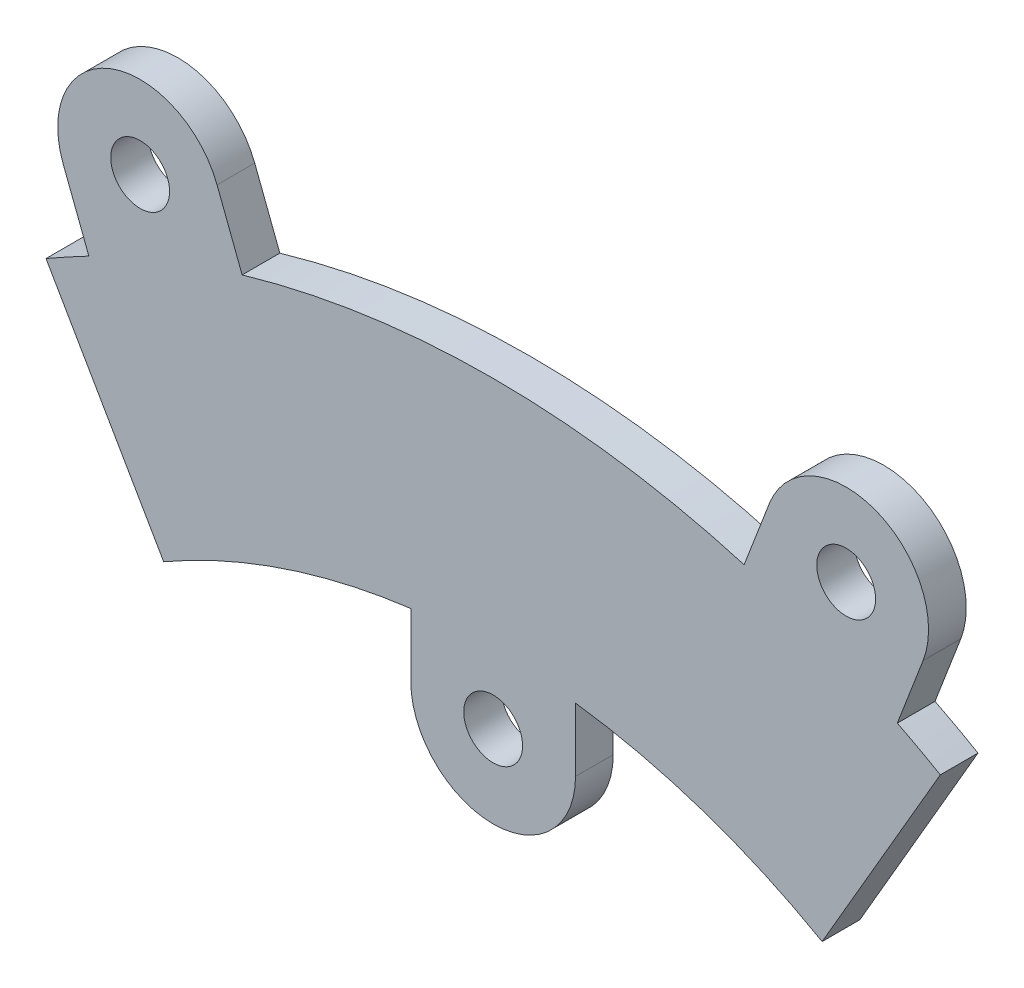
ISO-10303-21;
HEADER;
FILE_DESCRIPTION(('STEP AP214'),'2;1');
FILE_NAME('part.step','',(''),(''),'','','');
FILE_SCHEMA(('AUTOMOTIVE_DESIGN { 1 0 10303 214 1 1 1 1 }'));
ENDSEC;
DATA;
#1=APPLICATION_CONTEXT('core data for automotive mechanical design processes');
#2=APPLICATION_PROTOCOL_DEFINITION('international standard','automotive_design',2000,#1);
#3=PRODUCT_CONTEXT('',#1,'mechanical');
#4=PRODUCT('Part','Part','',(#3));
#5=PRODUCT_RELATED_PRODUCT_CATEGORY('part','',(#4));
#6=PRODUCT_DEFINITION_FORMATION('','',#4);
#7=PRODUCT_DEFINITION_CONTEXT('part definition',#1,'design');
#8=PRODUCT_DEFINITION('design','',#6,#7);
#9=PRODUCT_DEFINITION_SHAPE('','',#8);
#10=(LENGTH_UNIT() NAMED_UNIT(*) SI_UNIT(.MILLI.,.METRE.));
#11=(NAMED_UNIT(*) PLANE_ANGLE_UNIT() SI_UNIT($,.RADIAN.));
#12=(NAMED_UNIT(*) SI_UNIT($,.STERADIAN.) SOLID_ANGLE_UNIT());
#13=UNCERTAINTY_MEASURE_WITH_UNIT(LENGTH_MEASURE(1.E-05),#10,'distance_accuracy_value','');
#14=(GEOMETRIC_REPRESENTATION_CONTEXT(3) GLOBAL_UNCERTAINTY_ASSIGNED_CONTEXT((#13)) GLOBAL_UNIT_ASSIGNED_CONTEXT((#10,
#11,#12)) REPRESENTATION_CONTEXT('',''));
#15=CARTESIAN_POINT('',(0.,0.,0.));
#16=DIRECTION('',(0.,0.,1.));
#17=DIRECTION('',(1.,0.,0.));
#18=AXIS2_PLACEMENT_3D('',#15,#16,#17);
#19=CARTESIAN_POINT('',(-14.,24.249000549316,0.));
#20=DIRECTION('',(0.,0.,1.));
#21=DIRECTION('',(1.,0.,0.));
#22=AXIS2_PLACEMENT_3D('',#19,#20,#21);
#23=PLANE('',#22);
#24=CARTESIAN_POINT('',(15.00000048,38.0000002,0.));
#25=DIRECTION('',(0.,0.,1.));
#26=DIRECTION('',(1.,0.,0.));
#27=AXIS2_PLACEMENT_3D('',#24,#25,#26);
#28=CIRCLE('',#27,1.25000004);
#29=CARTESIAN_POINT('',(16.25000052,38.0000002,0.));
#30=VERTEX_POINT('',#29);
#31=EDGE_CURVE('E28',#30,#30,#28,.T.);
#32=ORIENTED_EDGE('',*,*,#31,.F.);
#33=EDGE_LOOP('',(#32));
#34=FACE_BOUND('',#33,.T.);
#35=CARTESIAN_POINT('',(0.,25.1000006,0.));
#36=DIRECTION('',(0.,0.,1.));
#37=DIRECTION('',(1.,0.,0.));
#38=AXIS2_PLACEMENT_3D('',#35,#36,#37);
#39=CIRCLE('',#38,1.25000004);
#40=CARTESIAN_POINT('',(1.25000004,25.1000006,0.));
#41=VERTEX_POINT('',#40);
#42=EDGE_CURVE('E320',#41,#41,#39,.T.);
#43=ORIENTED_EDGE('',*,*,#42,.F.);
#44=EDGE_LOOP('',(#43));
#45=FACE_BOUND('',#44,.T.);
#46=CARTESIAN_POINT('',(-15.00000048,38.0000002,0.));
#47=DIRECTION('',(0.,0.,1.));
#48=DIRECTION('',(1.,0.,0.));
#49=AXIS2_PLACEMENT_3D('',#46,#47,#48);
#50=CIRCLE('',#49,1.25000004);
#51=CARTESIAN_POINT('',(-13.75000044,38.0000002,0.));
#52=VERTEX_POINT('',#51);
#53=EDGE_CURVE('E156',#52,#52,#50,.T.);
#54=ORIENTED_EDGE('',*,*,#53,.F.);
#55=EDGE_LOOP('',(#54));
#56=FACE_BOUND('',#55,.T.);
#57=CARTESIAN_POINT('',(-0.0002940403183249,-0.004165200069904,0.));
#58=DIRECTION('',(0.,0.,1.));
#59=DIRECTION('',(-0.124972936293963,0.99216015098071,0.));
#60=AXIS2_PLACEMENT_3D('',#57,#58,#59);
#61=CIRCLE('',#60,28.003710750984);
#62=CARTESIAN_POINT('',(-3.5,27.780000686646,0.));
#63=VERTEX_POINT('',#62);
#64=CARTESIAN_POINT('',(-14.,24.249000549316,0.));
#65=VERTEX_POINT('',#64);
#66=EDGE_CURVE('E265',#63,#65,#61,.T.);
#67=ORIENTED_EDGE('',*,*,#66,.F.);
#68=DIRECTION('',(0.,1.,0.));
#69=VECTOR('',#68,1.);
#70=CARTESIAN_POINT('',(-3.5,25.10000038147,0.));
#71=LINE('',#70,#69);
#72=CARTESIAN_POINT('',(-3.5,25.10000038147,0.));
#73=VERTEX_POINT('',#72);
#74=EDGE_CURVE('E258',#73,#63,#71,.T.);
#75=ORIENTED_EDGE('',*,*,#74,.F.);
#76=CARTESIAN_POINT('',(0.,25.10000038147,0.));
#77=DIRECTION('',(0.,0.,-1.));
#78=DIRECTION('',(1.,0.,0.));
#79=AXIS2_PLACEMENT_3D('',#76,#77,#78);
#80=CIRCLE('',#79,3.5);
#81=CARTESIAN_POINT('',(3.5,25.10000038147,0.));
#82=VERTEX_POINT('',#81);
#83=EDGE_CURVE('E362',#82,#73,#80,.T.);
#84=ORIENTED_EDGE('',*,*,#83,.F.);
#85=DIRECTION('',(0.,-1.,0.));
#86=VECTOR('',#85,1.);
#87=CARTESIAN_POINT('',(3.5,27.799999237061,0.));
#88=LINE('',#87,#86);
#89=CARTESIAN_POINT('',(3.5,27.799999237061,0.));
#90=VERTEX_POINT('',#89);
#91=EDGE_CURVE('E287',#90,#82,#88,.T.);
#92=ORIENTED_EDGE('',*,*,#91,.F.);
#93=CARTESIAN_POINT('',(-0.218642823997,-0.497597265043,0.));
#94=DIRECTION('',(0.,0.,1.));
#95=DIRECTION('',(0.497414188617854,0.867513184315744,0.));
#96=AXIS2_PLACEMENT_3D('',#93,#94,#95);
#97=CIRCLE('',#96,28.540887727054);
#98=CARTESIAN_POINT('',(13.977999687195,24.261999130249,0.));
#99=VERTEX_POINT('',#98);
#100=EDGE_CURVE('E358',#99,#90,#97,.T.);
#101=ORIENTED_EDGE('',*,*,#100,.F.);
#102=DIRECTION('',(-0.502222335358218,-0.864738530347375,0.));
#103=VECTOR('',#102,1.);
#104=CARTESIAN_POINT('',(19.,32.909000396729,0.));
#105=LINE('',#104,#103);
#106=CARTESIAN_POINT('',(19.,32.909000396729,0.));
#107=VERTEX_POINT('',#106);
#108=EDGE_CURVE('E301',#107,#99,#105,.T.);
#109=ORIENTED_EDGE('',*,*,#108,.F.);
#110=CARTESIAN_POINT('',(-0.140882213122,-0.268365842203,0.));
#111=DIRECTION('',(0.,0.,-1.));
#112=DIRECTION('',(0.452025546648997,0.892004991676995,0.));
#113=AXIS2_PLACEMENT_3D('',#110,#111,#112);
#114=CIRCLE('',#113,38.302885040801);
#115=CARTESIAN_POINT('',(17.173000335693,33.897998809814,0.));
#116=VERTEX_POINT('',#115);
#117=EDGE_CURVE('E281',#116,#107,#114,.T.);
#118=ORIENTED_EDGE('',*,*,#117,.F.);
#119=DIRECTION('',(-0.358869119723112,-0.93338789091629,0.));
#120=VECTOR('',#119,1.);
#121=CARTESIAN_POINT('',(18.267999649048,36.745998382568,0.));
#122=LINE('',#121,#120);
#123=CARTESIAN_POINT('',(18.267999649048,36.745998382568,0.));
#124=VERTEX_POINT('',#123);
#125=EDGE_CURVE('E21',#124,#116,#122,.T.);
#126=ORIENTED_EDGE('',*,*,#125,.F.);
#127=CARTESIAN_POINT('',(15.000000393159,38.000001024595,0.));
#128=DIRECTION('',(0.,0.,-1.));
#129=DIRECTION('',(-0.933625064146048,0.358251642841018,0.));
#130=AXIS2_PLACEMENT_3D('',#127,#128,#129);
#131=CIRCLE('',#130,3.500334521542);
#132=CARTESIAN_POINT('',(11.732000350952,39.254001617432,0.));
#133=VERTEX_POINT('',#132);
#134=EDGE_CURVE('E214',#133,#124,#131,.T.);
#135=ORIENTED_EDGE('',*,*,#134,.F.);
#136=DIRECTION('',(0.358340811677967,0.933590843295914,0.));
#137=VECTOR('',#136,1.);
#138=CARTESIAN_POINT('',(10.678000450134,36.507999420166,0.));
#139=LINE('',#138,#137);
#140=CARTESIAN_POINT('',(10.678000450134,36.507999420166,0.));
#141=VERTEX_POINT('',#140);
#142=EDGE_CURVE('E217',#141,#133,#139,.T.);
#143=ORIENTED_EDGE('',*,*,#142,.F.);
#144=DIRECTION('',(0.26765439554602,0.963514984079072,0.));
#145=VECTOR('',#144,1.);
#146=CARTESIAN_POINT('',(10.668000221252,36.47200012207,0.));
#147=LINE('',#146,#145);
#148=CARTESIAN_POINT('',(10.668000221252,36.47200012207,0.));
#149=VERTEX_POINT('',#148);
#150=EDGE_CURVE('E386',#149,#141,#147,.T.);
#151=ORIENTED_EDGE('',*,*,#150,.F.);
#152=CARTESIAN_POINT('',(-0.0002088742041915,-0.005718831380889,0.));
#153=DIRECTION('',(0.,0.,-1.));
#154=DIRECTION('',(-0.280610166316937,0.959821824381786,0.));
#155=AXIS2_PLACEMENT_3D('',#152,#153,#154);
#156=CIRCLE('',#155,38.005718850607);
#157=CARTESIAN_POINT('',(-10.66499996185,36.472999572754,0.));
#158=VERTEX_POINT('',#157);
#159=EDGE_CURVE('E80',#158,#149,#156,.T.);
#160=ORIENTED_EDGE('',*,*,#159,.F.);
#161=DIRECTION('',(0.358213953449175,-0.933639525488457,0.));
#162=VECTOR('',#161,1.);
#163=CARTESIAN_POINT('',(-11.73200035095,39.254001617432,0.));
#164=LINE('',#163,#162);
#165=CARTESIAN_POINT('',(-11.73200035095,39.254001617432,0.));
#166=VERTEX_POINT('',#165);
#167=EDGE_CURVE('E375',#166,#158,#164,.T.);
#168=ORIENTED_EDGE('',*,*,#167,.F.);
#169=CARTESIAN_POINT('',(-15.00000039315,38.000001024595,0.));
#170=DIRECTION('',(0.,0.,-1.));
#171=DIRECTION('',(-0.933624839505129,-0.35825222826805,0.));
#172=AXIS2_PLACEMENT_3D('',#169,#170,#171);
#173=CIRCLE('',#172,3.500334521542);
#174=CARTESIAN_POINT('',(-18.26799964904,36.745998382568,0.));
#175=VERTEX_POINT('',#174);
#176=EDGE_CURVE('E411',#175,#166,#173,.T.);
#177=ORIENTED_EDGE('',*,*,#176,.F.);
#178=DIRECTION('',(-0.358538525678012,0.933514930574031,0.));
#179=VECTOR('',#178,1.);
#180=CARTESIAN_POINT('',(-17.17799949646,33.908000946045,0.));
#181=LINE('',#180,#179);
#182=CARTESIAN_POINT('',(-17.17799949646,33.908000946045,0.));
#183=VERTEX_POINT('',#182);
#184=EDGE_CURVE('E274',#183,#175,#181,.T.);
#185=ORIENTED_EDGE('',*,*,#184,.F.);
#186=CARTESIAN_POINT('',(12.43769959597,-22.2668056281,0.));
#187=DIRECTION('',(0.,0.,-1.));
#188=DIRECTION('',(-0.4950543505401,0.868862008613175,0.));
#189=AXIS2_PLACEMENT_3D('',#186,#187,#188);
#190=CIRCLE('',#189,63.503531605541);
#191=CARTESIAN_POINT('',(-19.,32.909000396729,0.));
#192=VERTEX_POINT('',#191);
#193=EDGE_CURVE('E345',#192,#183,#190,.T.);
#194=ORIENTED_EDGE('',*,*,#193,.F.);
#195=DIRECTION('',(-0.500011006970785,0.866019048813628,0.));
#196=VECTOR('',#195,1.);
#197=CARTESIAN_POINT('',(-14.,24.249000549316,0.));
#198=LINE('',#197,#196);
#199=EDGE_CURVE('E325',#65,#192,#198,.T.);
#200=ORIENTED_EDGE('',*,*,#199,.F.);
#201=EDGE_LOOP('',(#67,#75,#84,#92,#101,#109,#118,#126,#135,#143,#151,#160,#168,#177,#185,#194,#200));
#202=FACE_BOUND('',#201,.T.);
#203=ADVANCED_FACE('F17',(#34,#45,#56,#202),#23,.T.);
#204=CARTESIAN_POINT('',(-14.,24.249000549316,-1.60143952));
#205=DIRECTION('',(0.,0.,1.));
#206=DIRECTION('',(1.,0.,0.));
#207=AXIS2_PLACEMENT_3D('',#204,#205,#206);
#208=PLANE('',#207);
#209=CARTESIAN_POINT('',(15.00000048,38.0000002,-1.60143952));
#210=DIRECTION('',(0.,0.,1.));
#211=DIRECTION('',(1.,0.,0.));
#212=AXIS2_PLACEMENT_3D('',#209,#210,#211);
#213=CIRCLE('',#212,1.25000004);
#214=CARTESIAN_POINT('',(16.25000052,38.0000002,-1.60143952));
#215=VERTEX_POINT('',#214);
#216=EDGE_CURVE('E11',#215,#215,#213,.T.);
#217=ORIENTED_EDGE('',*,*,#216,.T.);
#218=EDGE_LOOP('',(#217));
#219=FACE_BOUND('',#218,.T.);
#220=CARTESIAN_POINT('',(0.,25.1000006,-1.60143952));
#221=DIRECTION('',(0.,0.,1.));
#222=DIRECTION('',(1.,0.,0.));
#223=AXIS2_PLACEMENT_3D('',#220,#221,#222);
#224=CIRCLE('',#223,1.25000004);
#225=CARTESIAN_POINT('',(1.25000004,25.1000006,-1.60143952));
#226=VERTEX_POINT('',#225);
#227=EDGE_CURVE('E316',#226,#226,#224,.T.);
#228=ORIENTED_EDGE('',*,*,#227,.T.);
#229=EDGE_LOOP('',(#228));
#230=FACE_BOUND('',#229,.T.);
#231=CARTESIAN_POINT('',(-15.00000048,38.0000002,-1.60143952));
#232=DIRECTION('',(0.,0.,1.));
#233=DIRECTION('',(1.,0.,0.));
#234=AXIS2_PLACEMENT_3D('',#231,#232,#233);
#235=CIRCLE('',#234,1.25000004);
#236=CARTESIAN_POINT('',(-13.75000044,38.0000002,-1.60143952));
#237=VERTEX_POINT('',#236);
#238=EDGE_CURVE('E168',#237,#237,#235,.T.);
#239=ORIENTED_EDGE('',*,*,#238,.T.);
#240=EDGE_LOOP('',(#239));
#241=FACE_BOUND('',#240,.T.);
#242=DIRECTION('',(-0.500011006970785,0.866019048813628,0.));
#243=VECTOR('',#242,1.);
#244=CARTESIAN_POINT('',(-14.,24.249000549316,-1.60143952));
#245=LINE('',#244,#243);
#246=CARTESIAN_POINT('',(-14.,24.249000549316,-1.60143952));
#247=VERTEX_POINT('',#246);
#248=CARTESIAN_POINT('',(-19.,32.909000396729,-1.60143952));
#249=VERTEX_POINT('',#248);
#250=EDGE_CURVE('E334',#247,#249,#245,.T.);
#251=ORIENTED_EDGE('',*,*,#250,.T.);
#252=CARTESIAN_POINT('',(12.43769959597,-22.2668056281,-1.60143952));
#253=DIRECTION('',(0.,0.,-1.));
#254=DIRECTION('',(-0.4950543505401,0.868862008613175,0.));
#255=AXIS2_PLACEMENT_3D('',#252,#253,#254);
#256=CIRCLE('',#255,63.503531605541);
#257=CARTESIAN_POINT('',(-17.17799949646,33.908000946045,-1.60143952));
#258=VERTEX_POINT('',#257);
#259=EDGE_CURVE('E270',#249,#258,#256,.T.);
#260=ORIENTED_EDGE('',*,*,#259,.T.);
#261=DIRECTION('',(-0.358538525678012,0.933514930574031,0.));
#262=VECTOR('',#261,1.);
#263=CARTESIAN_POINT('',(-17.17799949646,33.908000946045,-1.60143952));
#264=LINE('',#263,#262);
#265=CARTESIAN_POINT('',(-18.26799964904,36.745998382568,-1.60143952));
#266=VERTEX_POINT('',#265);
#267=EDGE_CURVE('E403',#258,#266,#264,.T.);
#268=ORIENTED_EDGE('',*,*,#267,.T.);
#269=CARTESIAN_POINT('',(-15.00000039315,38.000001024595,-1.60143952));
#270=DIRECTION('',(0.,0.,-1.));
#271=DIRECTION('',(-0.933624839505129,-0.35825222826805,0.));
#272=AXIS2_PLACEMENT_3D('',#269,#270,#271);
#273=CIRCLE('',#272,3.500334521542);
#274=CARTESIAN_POINT('',(-11.73200035095,39.254001617432,-1.60143952));
#275=VERTEX_POINT('',#274);
#276=EDGE_CURVE('E372',#266,#275,#273,.T.);
#277=ORIENTED_EDGE('',*,*,#276,.T.);
#278=DIRECTION('',(0.358213953449175,-0.933639525488457,0.));
#279=VECTOR('',#278,1.);
#280=CARTESIAN_POINT('',(-11.73200035095,39.254001617432,-1.60143952));
#281=LINE('',#280,#279);
#282=CARTESIAN_POINT('',(-10.66499996185,36.472999572754,-1.60143952));
#283=VERTEX_POINT('',#282);
#284=EDGE_CURVE('E68',#275,#283,#281,.T.);
#285=ORIENTED_EDGE('',*,*,#284,.T.);
#286=CARTESIAN_POINT('',(-0.0002088742041915,-0.005718831380889,-1.60143952));
#287=DIRECTION('',(0.,0.,-1.));
#288=DIRECTION('',(-0.280610166316937,0.959821824381786,0.));
#289=AXIS2_PLACEMENT_3D('',#286,#287,#288);
#290=CIRCLE('',#289,38.005718850607);
#291=CARTESIAN_POINT('',(10.668000221252,36.47200012207,-1.60143952));
#292=VERTEX_POINT('',#291);
#293=EDGE_CURVE('E297',#283,#292,#290,.T.);
#294=ORIENTED_EDGE('',*,*,#293,.T.);
#295=DIRECTION('',(0.26765439554602,0.963514984079072,0.));
#296=VECTOR('',#295,1.);
#297=CARTESIAN_POINT('',(10.668000221252,36.47200012207,-1.60143952));
#298=LINE('',#297,#296);
#299=CARTESIAN_POINT('',(10.678000450134,36.507999420166,-1.60143952));
#300=VERTEX_POINT('',#299);
#301=EDGE_CURVE('E241',#292,#300,#298,.T.);
#302=ORIENTED_EDGE('',*,*,#301,.T.);
#303=DIRECTION('',(0.358340811677967,0.933590843295914,0.));
#304=VECTOR('',#303,1.);
#305=CARTESIAN_POINT('',(10.678000450134,36.507999420166,-1.60143952));
#306=LINE('',#305,#304);
#307=CARTESIAN_POINT('',(11.732000350952,39.254001617432,-1.60143952));
#308=VERTEX_POINT('',#307);
#309=EDGE_CURVE('E225',#300,#308,#306,.T.);
#310=ORIENTED_EDGE('',*,*,#309,.T.);
#311=CARTESIAN_POINT('',(15.000000393159,38.000001024595,-1.60143952));
#312=DIRECTION('',(0.,0.,-1.));
#313=DIRECTION('',(-0.933625064146048,0.358251642841018,0.));
#314=AXIS2_PLACEMENT_3D('',#311,#312,#313);
#315=CIRCLE('',#314,3.500334521542);
#316=CARTESIAN_POINT('',(18.267999649048,36.745998382568,-1.60143952));
#317=VERTEX_POINT('',#316);
#318=EDGE_CURVE('E231',#308,#317,#315,.T.);
#319=ORIENTED_EDGE('',*,*,#318,.T.);
#320=DIRECTION('',(-0.358869119723112,-0.93338789091629,0.));
#321=VECTOR('',#320,1.);
#322=CARTESIAN_POINT('',(18.267999649048,36.745998382568,-1.60143952));
#323=LINE('',#322,#321);
#324=CARTESIAN_POINT('',(17.173000335693,33.897998809814,-1.60143952));
#325=VERTEX_POINT('',#324);
#326=EDGE_CURVE('E288',#317,#325,#323,.T.);
#327=ORIENTED_EDGE('',*,*,#326,.T.);
#328=CARTESIAN_POINT('',(-0.140882213122,-0.268365842203,-1.60143952));
#329=DIRECTION('',(0.,0.,-1.));
#330=DIRECTION('',(0.452025546648997,0.892004991676995,0.));
#331=AXIS2_PLACEMENT_3D('',#328,#329,#330);
#332=CIRCLE('',#331,38.302885040801);
#333=CARTESIAN_POINT('',(19.,32.909000396729,-1.60143952));
#334=VERTEX_POINT('',#333);
#335=EDGE_CURVE('E280',#325,#334,#332,.T.);
#336=ORIENTED_EDGE('',*,*,#335,.T.);
#337=DIRECTION('',(-0.502222335358218,-0.864738530347375,0.));
#338=VECTOR('',#337,1.);
#339=CARTESIAN_POINT('',(19.,32.909000396729,-1.60143952));
#340=LINE('',#339,#338);
#341=CARTESIAN_POINT('',(13.977999687195,24.261999130249,-1.60143952));
#342=VERTEX_POINT('',#341);
#343=EDGE_CURVE('E306',#334,#342,#340,.T.);
#344=ORIENTED_EDGE('',*,*,#343,.T.);
#345=CARTESIAN_POINT('',(-0.218642823997,-0.497597265043,-1.60143952));
#346=DIRECTION('',(0.,0.,1.));
#347=DIRECTION('',(0.497414188617854,0.867513184315744,0.));
#348=AXIS2_PLACEMENT_3D('',#345,#346,#347);
#349=CIRCLE('',#348,28.540887727054);
#350=CARTESIAN_POINT('',(3.5,27.799999237061,-1.60143952));
#351=VERTEX_POINT('',#350);
#352=EDGE_CURVE('E315',#342,#351,#349,.T.);
#353=ORIENTED_EDGE('',*,*,#352,.T.);
#354=DIRECTION('',(0.,-1.,0.));
#355=VECTOR('',#354,1.);
#356=CARTESIAN_POINT('',(3.5,27.799999237061,-1.60143952));
#357=LINE('',#356,#355);
#358=CARTESIAN_POINT('',(3.5,25.10000038147,-1.60143952));
#359=VERTEX_POINT('',#358);
#360=EDGE_CURVE('E286',#351,#359,#357,.T.);
#361=ORIENTED_EDGE('',*,*,#360,.T.);
#362=CARTESIAN_POINT('',(0.,25.10000038147,-1.60143952));
#363=DIRECTION('',(0.,0.,-1.));
#364=DIRECTION('',(1.,0.,0.));
#365=AXIS2_PLACEMENT_3D('',#362,#363,#364);
#366=CIRCLE('',#365,3.5);
#367=CARTESIAN_POINT('',(-3.5,25.10000038147,-1.60143952));
#368=VERTEX_POINT('',#367);
#369=EDGE_CURVE('E371',#359,#368,#366,.T.);
#370=ORIENTED_EDGE('',*,*,#369,.T.);
#371=DIRECTION('',(0.,1.,0.));
#372=VECTOR('',#371,1.);
#373=CARTESIAN_POINT('',(-3.5,25.10000038147,-1.60143952));
#374=LINE('',#373,#372);
#375=CARTESIAN_POINT('',(-3.5,27.780000686646,-1.60143952));
#376=VERTEX_POINT('',#375);
#377=EDGE_CURVE('E257',#368,#376,#374,.T.);
#378=ORIENTED_EDGE('',*,*,#377,.T.);
#379=CARTESIAN_POINT('',(-0.0002940403183249,-0.004165200069904,-1.60143952));
#380=DIRECTION('',(0.,0.,1.));
#381=DIRECTION('',(-0.124972936293963,0.99216015098071,0.));
#382=AXIS2_PLACEMENT_3D('',#379,#380,#381);
#383=CIRCLE('',#382,28.003710750984);
#384=EDGE_CURVE('E269',#376,#247,#383,.T.);
#385=ORIENTED_EDGE('',*,*,#384,.T.);
#386=EDGE_LOOP('',(#251,#260,#268,#277,#285,#294,#302,#310,#319,#327,#336,#344,#353,#361,#370,
#378,#385));
#387=FACE_BOUND('',#386,.T.);
#388=ADVANCED_FACE('F333',(#219,#230,#241,#387),#208,.F.);
#389=CARTESIAN_POINT('',(15.00000048,38.0000002,-1.60143952));
#390=DIRECTION('',(0.,0.,-1.));
#391=DIRECTION('',(1.,0.,0.));
#392=AXIS2_PLACEMENT_3D('',#389,#390,#391);
#393=CYLINDRICAL_SURFACE('',#392,1.25000004);
#394=DIRECTION('',(0.,0.,1.));
#395=VECTOR('',#394,1.);
#396=CARTESIAN_POINT('',(16.25000052,38.0000002,-1.60143952));
#397=LINE('',#396,#395);
#398=EDGE_CURVE('E319',#215,#30,#397,.T.);
#399=ORIENTED_EDGE('',*,*,#398,.T.);
#400=ORIENTED_EDGE('',*,*,#31,.T.);
#401=ORIENTED_EDGE('',*,*,#398,.F.);
#402=ORIENTED_EDGE('',*,*,#216,.F.);
#403=EDGE_LOOP('',(#399,#400,#401,#402));
#404=FACE_BOUND('',#403,.T.);
#405=ADVANCED_FACE('F461',(#404),#393,.F.);
#406=CARTESIAN_POINT('',(0.,25.1000006,-1.60143952));
#407=DIRECTION('',(0.,0.,-1.));
#408=DIRECTION('',(1.,0.,0.));
#409=AXIS2_PLACEMENT_3D('',#406,#407,#408);
#410=CYLINDRICAL_SURFACE('',#409,1.25000004);
#411=DIRECTION('',(0.,0.,1.));
#412=VECTOR('',#411,1.);
#413=CARTESIAN_POINT('',(1.25000004,25.1000006,-1.60143952));
#414=LINE('',#413,#412);
#415=EDGE_CURVE('E261',#226,#41,#414,.T.);
#416=ORIENTED_EDGE('',*,*,#415,.T.);
#417=ORIENTED_EDGE('',*,*,#42,.T.);
#418=ORIENTED_EDGE('',*,*,#415,.F.);
#419=ORIENTED_EDGE('',*,*,#227,.F.);
#420=EDGE_LOOP('',(#416,#417,#418,#419));
#421=FACE_BOUND('',#420,.T.);
#422=ADVANCED_FACE('F632',(#421),#410,.F.);
#423=CARTESIAN_POINT('',(-15.00000048,38.0000002,-1.60143952));
#424=DIRECTION('',(0.,0.,-1.));
#425=DIRECTION('',(1.,0.,0.));
#426=AXIS2_PLACEMENT_3D('',#423,#424,#425);
#427=CYLINDRICAL_SURFACE('',#426,1.25000004);
#428=DIRECTION('',(0.,0.,1.));
#429=VECTOR('',#428,1.);
#430=CARTESIAN_POINT('',(-13.75000044,38.0000002,-1.60143952));
#431=LINE('',#430,#429);
#432=EDGE_CURVE('E266',#237,#52,#431,.T.);
#433=ORIENTED_EDGE('',*,*,#432,.T.);
#434=ORIENTED_EDGE('',*,*,#53,.T.);
#435=ORIENTED_EDGE('',*,*,#432,.F.);
#436=ORIENTED_EDGE('',*,*,#238,.F.);
#437=EDGE_LOOP('',(#433,#434,#435,#436));
#438=FACE_BOUND('',#437,.T.);
#439=ADVANCED_FACE('F627',(#438),#427,.F.);
#440=CARTESIAN_POINT('',(-0.0002940403183249,-0.004165200069904,-1.60143952));
#441=DIRECTION('',(0.,0.,-1.));
#442=DIRECTION('',(-0.124972936293963,0.99216015098071,0.));
#443=AXIS2_PLACEMENT_3D('',#440,#441,#442);
#444=CYLINDRICAL_SURFACE('',#443,28.003710750984);
#445=DIRECTION('',(0.,0.,1.));
#446=VECTOR('',#445,1.);
#447=CARTESIAN_POINT('',(-3.5,27.780000686646,-1.60143952));
#448=LINE('',#447,#446);
#449=EDGE_CURVE('E253',#376,#63,#448,.T.);
#450=ORIENTED_EDGE('',*,*,#449,.T.);
#451=ORIENTED_EDGE('',*,*,#66,.T.);
#452=DIRECTION('',(0.,0.,1.));
#453=VECTOR('',#452,1.);
#454=CARTESIAN_POINT('',(-14.,24.249000549316,-1.60143952));
#455=LINE('',#454,#453);
#456=EDGE_CURVE('E321',#247,#65,#455,.T.);
#457=ORIENTED_EDGE('',*,*,#456,.F.);
#458=ORIENTED_EDGE('',*,*,#384,.F.);
#459=EDGE_LOOP('',(#450,#451,#457,#458));
#460=FACE_BOUND('',#459,.T.);
#461=ADVANCED_FACE('F346',(#460),#444,.F.);
#462=CARTESIAN_POINT('',(-3.5,25.10000038147,-1.60143952));
#463=DIRECTION('',(-1.,0.,0.));
#464=DIRECTION('',(0.,0.,1.));
#465=AXIS2_PLACEMENT_3D('',#462,#463,#464);
#466=PLANE('',#465);
#467=DIRECTION('',(0.,0.,1.));
#468=VECTOR('',#467,1.);
#469=CARTESIAN_POINT('',(-3.5,25.10000038147,-1.60143952));
#470=LINE('',#469,#468);
#471=EDGE_CURVE('E367',#368,#73,#470,.T.);
#472=ORIENTED_EDGE('',*,*,#471,.T.);
#473=ORIENTED_EDGE('',*,*,#74,.T.);
#474=ORIENTED_EDGE('',*,*,#449,.F.);
#475=ORIENTED_EDGE('',*,*,#377,.F.);
#476=EDGE_LOOP('',(#472,#473,#474,#475));
#477=FACE_BOUND('',#476,.T.);
#478=ADVANCED_FACE('F471',(#477),#466,.T.);
#479=CARTESIAN_POINT('',(0.,25.10000038147,-1.60143952));
#480=DIRECTION('',(0.,0.,-1.));
#481=DIRECTION('',(1.,0.,0.));
#482=AXIS2_PLACEMENT_3D('',#479,#480,#481);
#483=CYLINDRICAL_SURFACE('',#482,3.5);
#484=DIRECTION('',(0.,0.,1.));
#485=VECTOR('',#484,1.);
#486=CARTESIAN_POINT('',(3.5,25.10000038147,-1.60143952));
#487=LINE('',#486,#485);
#488=EDGE_CURVE('E282',#359,#82,#487,.T.);
#489=ORIENTED_EDGE('',*,*,#488,.T.);
#490=ORIENTED_EDGE('',*,*,#83,.T.);
#491=ORIENTED_EDGE('',*,*,#471,.F.);
#492=ORIENTED_EDGE('',*,*,#369,.F.);
#493=EDGE_LOOP('',(#489,#490,#491,#492));
#494=FACE_BOUND('',#493,.T.);
#495=ADVANCED_FACE('F468',(#494),#483,.T.);
#496=CARTESIAN_POINT('',(3.5,27.799999237061,-1.60143952));
#497=DIRECTION('',(1.,0.,0.));
#498=DIRECTION('',(0.,1.,0.));
#499=AXIS2_PLACEMENT_3D('',#496,#497,#498);
#500=PLANE('',#499);
#501=DIRECTION('',(0.,0.,1.));
#502=VECTOR('',#501,1.);
#503=CARTESIAN_POINT('',(3.5,27.799999237061,-1.60143952));
#504=LINE('',#503,#502);
#505=EDGE_CURVE('E377',#351,#90,#504,.T.);
#506=ORIENTED_EDGE('',*,*,#505,.T.);
#507=ORIENTED_EDGE('',*,*,#91,.T.);
#508=ORIENTED_EDGE('',*,*,#488,.F.);
#509=ORIENTED_EDGE('',*,*,#360,.F.);
#510=EDGE_LOOP('',(#506,#507,#508,#509));
#511=FACE_BOUND('',#510,.T.);
#512=ADVANCED_FACE('F470',(#511),#500,.T.);
#513=CARTESIAN_POINT('',(-0.218642823997,-0.497597265043,-1.60143952));
#514=DIRECTION('',(0.,0.,-1.));
#515=DIRECTION('',(0.497414188617853,0.867513184315744,0.));
#516=AXIS2_PLACEMENT_3D('',#513,#514,#515);
#517=CYLINDRICAL_SURFACE('',#516,28.540887727054);
#518=DIRECTION('',(0.,0.,1.));
#519=VECTOR('',#518,1.);
#520=CARTESIAN_POINT('',(13.977999687195,24.261999130249,-1.60143952));
#521=LINE('',#520,#519);
#522=EDGE_CURVE('E302',#342,#99,#521,.T.);
#523=ORIENTED_EDGE('',*,*,#522,.T.);
#524=ORIENTED_EDGE('',*,*,#100,.T.);
#525=ORIENTED_EDGE('',*,*,#505,.F.);
#526=ORIENTED_EDGE('',*,*,#352,.F.);
#527=EDGE_LOOP('',(#523,#524,#525,#526));
#528=FACE_BOUND('',#527,.T.);
#529=ADVANCED_FACE('F612',(#528),#517,.F.);
#530=CARTESIAN_POINT('',(19.,32.909000396729,-1.60143952));
#531=DIRECTION('',(0.864738530347375,-0.502222335358218,0.));
#532=DIRECTION('',(0.,0.,-1.));
#533=AXIS2_PLACEMENT_3D('',#530,#531,#532);
#534=PLANE('',#533);
#535=DIRECTION('',(0.,0.,1.));
#536=VECTOR('',#535,1.);
#537=CARTESIAN_POINT('',(19.,32.909000396729,-1.60143952));
#538=LINE('',#537,#536);
#539=EDGE_CURVE('E276',#334,#107,#538,.T.);
#540=ORIENTED_EDGE('',*,*,#539,.T.);
#541=ORIENTED_EDGE('',*,*,#108,.T.);
#542=ORIENTED_EDGE('',*,*,#522,.F.);
#543=ORIENTED_EDGE('',*,*,#343,.F.);
#544=EDGE_LOOP('',(#540,#541,#542,#543));
#545=FACE_BOUND('',#544,.T.);
#546=ADVANCED_FACE('F606',(#545),#534,.T.);
#547=CARTESIAN_POINT('',(-0.140882213122,-0.268365842203,-1.60143952));
#548=DIRECTION('',(0.,0.,-1.));
#549=DIRECTION('',(0.452025546648997,0.892004991676995,0.));
#550=AXIS2_PLACEMENT_3D('',#547,#548,#549);
#551=CYLINDRICAL_SURFACE('',#550,38.302885040801);
#552=DIRECTION('',(0.,0.,1.));
#553=VECTOR('',#552,1.);
#554=CARTESIAN_POINT('',(17.173000335693,33.897998809814,-1.60143952));
#555=LINE('',#554,#553);
#556=EDGE_CURVE('E292',#325,#116,#555,.T.);
#557=ORIENTED_EDGE('',*,*,#556,.T.);
#558=ORIENTED_EDGE('',*,*,#117,.T.);
#559=ORIENTED_EDGE('',*,*,#539,.F.);
#560=ORIENTED_EDGE('',*,*,#335,.F.);
#561=EDGE_LOOP('',(#557,#558,#559,#560));
#562=FACE_BOUND('',#561,.T.);
#563=ADVANCED_FACE('F611',(#562),#551,.T.);
#564=CARTESIAN_POINT('',(18.267999649048,36.745998382568,-1.60143952));
#565=DIRECTION('',(0.93338789091629,-0.358869119723112,0.));
#566=DIRECTION('',(0.,0.,-1.));
#567=AXIS2_PLACEMENT_3D('',#564,#565,#566);
#568=PLANE('',#567);
#569=DIRECTION('',(0.,0.,1.));
#570=VECTOR('',#569,1.);
#571=CARTESIAN_POINT('',(18.267999649048,36.745998382568,-1.60143952));
#572=LINE('',#571,#570);
#573=EDGE_CURVE('E224',#317,#124,#572,.T.);
#574=ORIENTED_EDGE('',*,*,#573,.T.);
#575=ORIENTED_EDGE('',*,*,#125,.T.);
#576=ORIENTED_EDGE('',*,*,#556,.F.);
#577=ORIENTED_EDGE('',*,*,#326,.F.);
#578=EDGE_LOOP('',(#574,#575,#576,#577));
#579=FACE_BOUND('',#578,.T.);
#580=ADVANCED_FACE('F475',(#579),#568,.T.);
#581=CARTESIAN_POINT('',(15.000000393159,38.000001024595,-1.60143952));
#582=DIRECTION('',(0.,0.,-1.));
#583=DIRECTION('',(-0.933625064146048,0.358251642841018,0.));
#584=AXIS2_PLACEMENT_3D('',#581,#582,#583);
#585=CYLINDRICAL_SURFACE('',#584,3.500334521542);
#586=DIRECTION('',(0.,0.,1.));
#587=VECTOR('',#586,1.);
#588=CARTESIAN_POINT('',(11.732000350952,39.254001617432,-1.60143952));
#589=LINE('',#588,#587);
#590=EDGE_CURVE('E228',#308,#133,#589,.T.);
#591=ORIENTED_EDGE('',*,*,#590,.T.);
#592=ORIENTED_EDGE('',*,*,#134,.T.);
#593=ORIENTED_EDGE('',*,*,#573,.F.);
#594=ORIENTED_EDGE('',*,*,#318,.F.);
#595=EDGE_LOOP('',(#591,#592,#593,#594));
#596=FACE_BOUND('',#595,.T.);
#597=ADVANCED_FACE('F229',(#596),#585,.T.);
#598=CARTESIAN_POINT('',(10.678000450134,36.507999420166,-1.60143952));
#599=DIRECTION('',(-0.933590843295914,0.358340811677967,0.));
#600=DIRECTION('',(0.,0.,1.));
#601=AXIS2_PLACEMENT_3D('',#598,#599,#600);
#602=PLANE('',#601);
#603=DIRECTION('',(0.,0.,1.));
#604=VECTOR('',#603,1.);
#605=CARTESIAN_POINT('',(10.678000450134,36.507999420166,-1.60143952));
#606=LINE('',#605,#604);
#607=EDGE_CURVE('E238',#300,#141,#606,.T.);
#608=ORIENTED_EDGE('',*,*,#607,.T.);
#609=ORIENTED_EDGE('',*,*,#142,.T.);
#610=ORIENTED_EDGE('',*,*,#590,.F.);
#611=ORIENTED_EDGE('',*,*,#309,.F.);
#612=EDGE_LOOP('',(#608,#609,#610,#611));
#613=FACE_BOUND('',#612,.T.);
#614=ADVANCED_FACE('F236',(#613),#602,.T.);
#615=CARTESIAN_POINT('',(10.668000221252,36.47200012207,-1.60143952));
#616=DIRECTION('',(-0.963514984079072,0.26765439554602,0.));
#617=DIRECTION('',(0.,0.,1.));
#618=AXIS2_PLACEMENT_3D('',#615,#616,#617);
#619=PLANE('',#618);
#620=DIRECTION('',(0.,0.,1.));
#621=VECTOR('',#620,1.);
#622=CARTESIAN_POINT('',(10.668000221252,36.47200012207,-1.60143952));
#623=LINE('',#622,#621);
#624=EDGE_CURVE('E293',#292,#149,#623,.T.);
#625=ORIENTED_EDGE('',*,*,#624,.T.);
#626=ORIENTED_EDGE('',*,*,#150,.T.);
#627=ORIENTED_EDGE('',*,*,#607,.F.);
#628=ORIENTED_EDGE('',*,*,#301,.F.);
#629=EDGE_LOOP('',(#625,#626,#627,#628));
#630=FACE_BOUND('',#629,.T.);
#631=ADVANCED_FACE('F450',(#630),#619,.T.);
#632=CARTESIAN_POINT('',(-0.0002088742041915,-0.005718831380889,-1.60143952));
#633=DIRECTION('',(0.,0.,-1.));
#634=DIRECTION('',(-0.280610166316937,0.959821824381786,0.));
#635=AXIS2_PLACEMENT_3D('',#632,#633,#634);
#636=CYLINDRICAL_SURFACE('',#635,38.005718850607);
#637=DIRECTION('',(0.,0.,1.));
#638=VECTOR('',#637,1.);
#639=CARTESIAN_POINT('',(-10.66499996185,36.472999572754,-1.60143952));
#640=LINE('',#639,#638);
#641=EDGE_CURVE('E251',#283,#158,#640,.T.);
#642=ORIENTED_EDGE('',*,*,#641,.T.);
#643=ORIENTED_EDGE('',*,*,#159,.T.);
#644=ORIENTED_EDGE('',*,*,#624,.F.);
#645=ORIENTED_EDGE('',*,*,#293,.F.);
#646=EDGE_LOOP('',(#642,#643,#644,#645));
#647=FACE_BOUND('',#646,.T.);
#648=ADVANCED_FACE('F441',(#647),#636,.T.);
#649=CARTESIAN_POINT('',(-11.73200035095,39.254001617432,-1.60143952));
#650=DIRECTION('',(0.933639525488457,0.358213953449175,0.));
#651=DIRECTION('',(0.,0.,-1.));
#652=AXIS2_PLACEMENT_3D('',#649,#650,#651);
#653=PLANE('',#652);
#654=DIRECTION('',(0.,0.,1.));
#655=VECTOR('',#654,1.);
#656=CARTESIAN_POINT('',(-11.73200035095,39.254001617432,-1.60143952));
#657=LINE('',#656,#655);
#658=EDGE_CURVE('E376',#275,#166,#657,.T.);
#659=ORIENTED_EDGE('',*,*,#658,.T.);
#660=ORIENTED_EDGE('',*,*,#167,.T.);
#661=ORIENTED_EDGE('',*,*,#641,.F.);
#662=ORIENTED_EDGE('',*,*,#284,.F.);
#663=EDGE_LOOP('',(#659,#660,#661,#662));
#664=FACE_BOUND('',#663,.T.);
#665=ADVANCED_FACE('F439',(#664),#653,.T.);
#666=CARTESIAN_POINT('',(-15.00000039315,38.000001024595,-1.60143952));
#667=DIRECTION('',(0.,0.,-1.));
#668=DIRECTION('',(-0.933624839505129,-0.35825222826805,0.));
#669=AXIS2_PLACEMENT_3D('',#666,#667,#668);
#670=CYLINDRICAL_SURFACE('',#669,3.500334521542);
#671=DIRECTION('',(0.,0.,1.));
#672=VECTOR('',#671,1.);
#673=CARTESIAN_POINT('',(-18.26799964904,36.745998382568,-1.60143952));
#674=LINE('',#673,#672);
#675=EDGE_CURVE('E396',#266,#175,#674,.T.);
#676=ORIENTED_EDGE('',*,*,#675,.T.);
#677=ORIENTED_EDGE('',*,*,#176,.T.);
#678=ORIENTED_EDGE('',*,*,#658,.F.);
#679=ORIENTED_EDGE('',*,*,#276,.F.);
#680=EDGE_LOOP('',(#676,#677,#678,#679));
#681=FACE_BOUND('',#680,.T.);
#682=ADVANCED_FACE('F438',(#681),#670,.T.);
#683=CARTESIAN_POINT('',(-17.17799949646,33.908000946045,-1.60143952));
#684=DIRECTION('',(-0.933514930574031,-0.358538525678012,0.));
#685=DIRECTION('',(-0.358538525678012,0.933514930574031,0.));
#686=AXIS2_PLACEMENT_3D('',#683,#684,#685);
#687=PLANE('',#686);
#688=DIRECTION('',(0.,0.,1.));
#689=VECTOR('',#688,1.);
#690=CARTESIAN_POINT('',(-17.17799949646,33.908000946045,-1.60143952));
#691=LINE('',#690,#689);
#692=EDGE_CURVE('E275',#258,#183,#691,.T.);
#693=ORIENTED_EDGE('',*,*,#692,.T.);
#694=ORIENTED_EDGE('',*,*,#184,.T.);
#695=ORIENTED_EDGE('',*,*,#675,.F.);
#696=ORIENTED_EDGE('',*,*,#267,.F.);
#697=EDGE_LOOP('',(#693,#694,#695,#696));
#698=FACE_BOUND('',#697,.T.);
#699=ADVANCED_FACE('F448',(#698),#687,.T.);
#700=CARTESIAN_POINT('',(12.43769959597,-22.2668056281,-1.60143952));
#701=DIRECTION('',(0.,0.,-1.));
#702=DIRECTION('',(-0.4950543505401,0.868862008613175,0.));
#703=AXIS2_PLACEMENT_3D('',#700,#701,#702);
#704=CYLINDRICAL_SURFACE('',#703,63.503531605541);
#705=DIRECTION('',(0.,0.,1.));
#706=VECTOR('',#705,1.);
#707=CARTESIAN_POINT('',(-19.,32.909000396729,-1.60143952));
#708=LINE('',#707,#706);
#709=EDGE_CURVE('E343',#249,#192,#708,.T.);
#710=ORIENTED_EDGE('',*,*,#709,.T.);
#711=ORIENTED_EDGE('',*,*,#193,.T.);
#712=ORIENTED_EDGE('',*,*,#692,.F.);
#713=ORIENTED_EDGE('',*,*,#259,.F.);
#714=EDGE_LOOP('',(#710,#711,#712,#713));
#715=FACE_BOUND('',#714,.T.);
#716=ADVANCED_FACE('F476',(#715),#704,.T.);
#717=CARTESIAN_POINT('',(-14.,24.249000549316,-1.60143952));
#718=DIRECTION('',(-0.866019048813628,-0.500011006970785,0.));
#719=DIRECTION('',(-0.500011006970785,0.866019048813628,0.));
#720=AXIS2_PLACEMENT_3D('',#717,#718,#719);
#721=PLANE('',#720);
#722=ORIENTED_EDGE('',*,*,#456,.T.);
#723=ORIENTED_EDGE('',*,*,#199,.T.);
#724=ORIENTED_EDGE('',*,*,#709,.F.);
#725=ORIENTED_EDGE('',*,*,#250,.F.);
#726=EDGE_LOOP('',(#722,#723,#724,#725));
#727=FACE_BOUND('',#726,.T.);
#728=ADVANCED_FACE('F19',(#727),#721,.T.);
#729=CLOSED_SHELL('',(#203,#388,#405,#422,#439,#461,#478,#495,#512,#529,#546,#563,#580,#597,
#614,#631,#648,#665,#682,#699,#716,#728));
#730=MANIFOLD_SOLID_BREP('B1',#729);
#731=ADVANCED_BREP_SHAPE_REPRESENTATION('',(#18,#730),#14);
#732=SHAPE_DEFINITION_REPRESENTATION(#9,#731);
ENDSEC;
END-ISO-10303-21;
